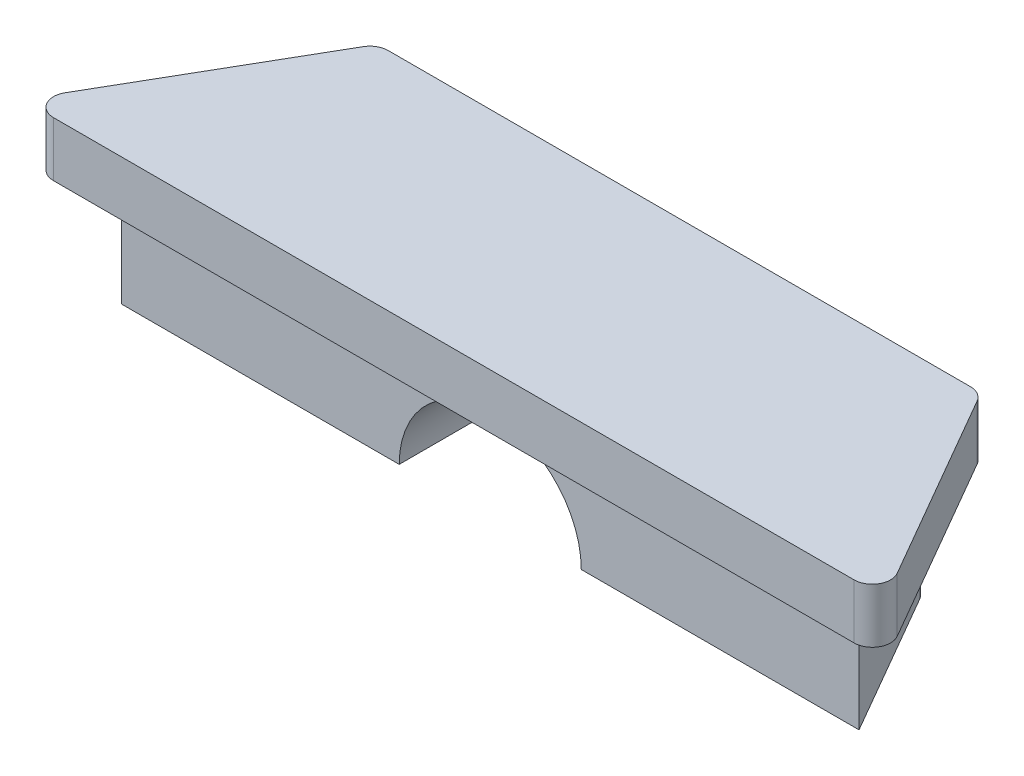
ISO-10303-21;
HEADER;
FILE_DESCRIPTION(('STEP AP214'),'2;1');
FILE_NAME('part.step','',(''),(''),'','','');
FILE_SCHEMA(('AUTOMOTIVE_DESIGN { 1 0 10303 214 1 1 1 1 }'));
ENDSEC;
DATA;
#1=APPLICATION_CONTEXT('core data for automotive mechanical design processes');
#2=APPLICATION_PROTOCOL_DEFINITION('international standard','automotive_design',2000,#1);
#3=PRODUCT_CONTEXT('',#1,'mechanical');
#4=PRODUCT('Part','Part','',(#3));
#5=PRODUCT_RELATED_PRODUCT_CATEGORY('part','',(#4));
#6=PRODUCT_DEFINITION_FORMATION('','',#4);
#7=PRODUCT_DEFINITION_CONTEXT('part definition',#1,'design');
#8=PRODUCT_DEFINITION('design','',#6,#7);
#9=PRODUCT_DEFINITION_SHAPE('','',#8);
#10=(LENGTH_UNIT() NAMED_UNIT(*) SI_UNIT(.MILLI.,.METRE.));
#11=(NAMED_UNIT(*) PLANE_ANGLE_UNIT() SI_UNIT($,.RADIAN.));
#12=(NAMED_UNIT(*) SI_UNIT($,.STERADIAN.) SOLID_ANGLE_UNIT());
#13=UNCERTAINTY_MEASURE_WITH_UNIT(LENGTH_MEASURE(1.E-05),#10,'distance_accuracy_value','');
#14=(GEOMETRIC_REPRESENTATION_CONTEXT(3) GLOBAL_UNCERTAINTY_ASSIGNED_CONTEXT((#13)) GLOBAL_UNIT_ASSIGNED_CONTEXT((#10,
#11,#12)) REPRESENTATION_CONTEXT('',''));
#15=CARTESIAN_POINT('',(0.,0.,0.));
#16=DIRECTION('',(0.,0.,1.));
#17=DIRECTION('',(1.,0.,0.));
#18=AXIS2_PLACEMENT_3D('',#15,#16,#17);
#19=CARTESIAN_POINT('',(-21.0429613812121,0.,-70.8226089891099));
#20=DIRECTION('',(0.,-1.,0.));
#21=DIRECTION('',(0.,0.,-1.));
#22=AXIS2_PLACEMENT_3D('',#19,#20,#21);
#23=PLANE('',#22);
#24=DIRECTION('',(0.,0.,1.));
#25=VECTOR('',#24,1.);
#26=CARTESIAN_POINT('',(-30.8790085716438,0.,-73.4389093969362));
#27=LINE('',#26,#25);
#28=CARTESIAN_POINT('',(-30.8790085716438,0.,-71.8226089891099));
#29=VERTEX_POINT('',#28);
#30=CARTESIAN_POINT('',(-30.8790085716438,0.,-63.4389093969362));
#31=VERTEX_POINT('',#30);
#32=EDGE_CURVE('E11',#29,#31,#27,.T.);
#33=ORIENTED_EDGE('',*,*,#32,.F.);
#34=DIRECTION('',(-1.,0.,0.));
#35=VECTOR('',#34,1.);
#36=CARTESIAN_POINT('',(-21.0429613812121,0.,-71.8226089891099));
#37=LINE('',#36,#35);
#38=CARTESIAN_POINT('',(-21.0429613812121,0.,-71.8226089891099));
#39=VERTEX_POINT('',#38);
#40=EDGE_CURVE('E143',#39,#29,#37,.T.);
#41=ORIENTED_EDGE('',*,*,#40,.F.);
#42=CARTESIAN_POINT('',(-21.0429613812121,0.,-70.8226089891099));
#43=DIRECTION('',(0.,1.,0.));
#44=DIRECTION('',(0.,0.,-1.));
#45=AXIS2_PLACEMENT_3D('',#42,#43,#44);
#46=CIRCLE('',#45,0.999999999999986);
#47=CARTESIAN_POINT('',(-20.1769359774277,0.,-71.3226089891099));
#48=VERTEX_POINT('',#47);
#49=EDGE_CURVE('E138',#48,#39,#46,.T.);
#50=ORIENTED_EDGE('',*,*,#49,.F.);
#51=DIRECTION('',(-0.500000000000046,0.,-0.866025403784412));
#52=VECTOR('',#51,1.);
#53=CARTESIAN_POINT('',(-15.6252798956755,0.,-63.4389093969362));
#54=LINE('',#53,#52);
#55=CARTESIAN_POINT('',(-15.6252798956755,0.,-63.4389093969362));
#56=VERTEX_POINT('',#55);
#57=EDGE_CURVE('E87',#56,#48,#54,.T.);
#58=ORIENTED_EDGE('',*,*,#57,.F.);
#59=DIRECTION('',(1.,0.,0.));
#60=VECTOR('',#59,1.);
#61=CARTESIAN_POINT('',(-15.6252798956755,0.,-63.4389093969362));
#62=LINE('',#61,#60);
#63=EDGE_CURVE('E149',#31,#56,#62,.T.);
#64=ORIENTED_EDGE('',*,*,#63,.F.);
#65=EDGE_LOOP('',(#33,#41,#50,#58,#64));
#66=FACE_BOUND('',#65,.T.);
#67=ADVANCED_FACE('F37',(#66),#23,.T.);
#68=CARTESIAN_POINT('',(-21.0429613812121,6.,-70.8226089891099));
#69=DIRECTION('',(0.,-1.,0.));
#70=DIRECTION('',(0.,0.,-1.));
#71=AXIS2_PLACEMENT_3D('',#68,#69,#70);
#72=CYLINDRICAL_SURFACE('',#71,0.999999999999986);
#73=ORIENTED_EDGE('',*,*,#49,.T.);
#74=DIRECTION('',(0.,-1.,0.));
#75=VECTOR('',#74,1.);
#76=CARTESIAN_POINT('',(-21.0429613812121,6.,-71.8226089891099));
#77=LINE('',#76,#75);
#78=CARTESIAN_POINT('',(-21.0429613812121,6.,-71.8226089891099));
#79=VERTEX_POINT('',#78);
#80=EDGE_CURVE('E158',#79,#39,#77,.T.);
#81=ORIENTED_EDGE('',*,*,#80,.F.);
#82=CARTESIAN_POINT('',(-21.0429613812121,6.,-70.8226089891099));
#83=DIRECTION('',(0.,1.,0.));
#84=DIRECTION('',(0.,0.,-1.));
#85=AXIS2_PLACEMENT_3D('',#82,#83,#84);
#86=CIRCLE('',#85,0.999999999999986);
#87=CARTESIAN_POINT('',(-20.1769359774277,6.,-71.3226089891099));
#88=VERTEX_POINT('',#87);
#89=EDGE_CURVE('E130',#88,#79,#86,.T.);
#90=ORIENTED_EDGE('',*,*,#89,.F.);
#91=DIRECTION('',(0.,-1.,0.));
#92=VECTOR('',#91,1.);
#93=CARTESIAN_POINT('',(-20.1769359774277,6.,-71.3226089891099));
#94=LINE('',#93,#92);
#95=EDGE_CURVE('E137',#88,#48,#94,.T.);
#96=ORIENTED_EDGE('',*,*,#95,.T.);
#97=EDGE_LOOP('',(#73,#81,#90,#96));
#98=FACE_BOUND('',#97,.T.);
#99=ADVANCED_FACE('F39',(#98),#72,.T.);
#100=CARTESIAN_POINT('',(-21.0429613812121,6.,-71.8226089891099));
#101=DIRECTION('',(0.,0.,1.));
#102=DIRECTION('',(1.,0.,0.));
#103=AXIS2_PLACEMENT_3D('',#100,#101,#102);
#104=PLANE('',#103);
#105=ORIENTED_EDGE('',*,*,#40,.T.);
#106=CARTESIAN_POINT('',(-35.8790085716438,0.,-71.8226089891099));
#107=DIRECTION('',(0.,0.,1.));
#108=DIRECTION('',(1.,0.,0.));
#109=AXIS2_PLACEMENT_3D('',#106,#107,#108);
#110=CIRCLE('',#109,5.);
#111=CARTESIAN_POINT('',(-40.8790085716438,0.,-71.8226089891099));
#112=VERTEX_POINT('',#111);
#113=EDGE_CURVE('E164',#29,#112,#110,.T.);
#114=ORIENTED_EDGE('',*,*,#113,.T.);
#115=CARTESIAN_POINT('',(-50.7150557620761,0.,-71.8226089891099));
#116=VERTEX_POINT('',#115);
#117=EDGE_CURVE('E141',#112,#116,#37,.T.);
#118=ORIENTED_EDGE('',*,*,#117,.T.);
#119=DIRECTION('',(0.,-1.,0.));
#120=VECTOR('',#119,1.);
#121=CARTESIAN_POINT('',(-50.7150557620761,6.,-71.8226089891099));
#122=LINE('',#121,#120);
#123=CARTESIAN_POINT('',(-50.7150557620761,6.,-71.8226089891099));
#124=VERTEX_POINT('',#123);
#125=EDGE_CURVE('E115',#124,#116,#122,.T.);
#126=ORIENTED_EDGE('',*,*,#125,.F.);
#127=DIRECTION('',(-1.,0.,0.));
#128=VECTOR('',#127,1.);
#129=CARTESIAN_POINT('',(-21.0429613812121,6.,-71.8226089891099));
#130=LINE('',#129,#128);
#131=EDGE_CURVE('E96',#79,#124,#130,.T.);
#132=ORIENTED_EDGE('',*,*,#131,.F.);
#133=ORIENTED_EDGE('',*,*,#80,.T.);
#134=EDGE_LOOP('',(#105,#114,#118,#126,#132,#133));
#135=FACE_BOUND('',#134,.T.);
#136=ADVANCED_FACE('F171',(#135),#104,.F.);
#137=CARTESIAN_POINT('',(-50.7150557620761,6.,-70.8226089891098));
#138=DIRECTION('',(0.,-1.,0.));
#139=DIRECTION('',(0.,0.,-1.));
#140=AXIS2_PLACEMENT_3D('',#137,#138,#139);
#141=CYLINDRICAL_SURFACE('',#140,1.);
#142=CARTESIAN_POINT('',(-50.7150557620761,0.,-70.8226089891098));
#143=DIRECTION('',(0.,1.,0.));
#144=DIRECTION('',(0.,0.,1.));
#145=AXIS2_PLACEMENT_3D('',#142,#143,#144);
#146=CIRCLE('',#145,1.);
#147=CARTESIAN_POINT('',(-51.5810811658605,0.,-71.3226089891098));
#148=VERTEX_POINT('',#147);
#149=EDGE_CURVE('E112',#116,#148,#146,.T.);
#150=ORIENTED_EDGE('',*,*,#149,.T.);
#151=DIRECTION('',(0.,-1.,0.));
#152=VECTOR('',#151,1.);
#153=CARTESIAN_POINT('',(-51.5810811658605,6.,-71.3226089891098));
#154=LINE('',#153,#152);
#155=CARTESIAN_POINT('',(-51.5810811658605,6.,-71.3226089891098));
#156=VERTEX_POINT('',#155);
#157=EDGE_CURVE('E105',#156,#148,#154,.T.);
#158=ORIENTED_EDGE('',*,*,#157,.F.);
#159=CARTESIAN_POINT('',(-50.7150557620761,6.,-70.8226089891098));
#160=DIRECTION('',(0.,1.,0.));
#161=DIRECTION('',(0.,0.,1.));
#162=AXIS2_PLACEMENT_3D('',#159,#160,#161);
#163=CIRCLE('',#162,1.);
#164=EDGE_CURVE('E110',#124,#156,#163,.T.);
#165=ORIENTED_EDGE('',*,*,#164,.F.);
#166=ORIENTED_EDGE('',*,*,#125,.T.);
#167=EDGE_LOOP('',(#150,#158,#165,#166));
#168=FACE_BOUND('',#167,.T.);
#169=ADVANCED_FACE('F107',(#168),#141,.T.);
#170=CARTESIAN_POINT('',(-56.1327372476121,6.,-63.4389093969362));
#171=DIRECTION('',(0.866025403784439,0.,0.499999999999999));
#172=DIRECTION('',(0.499999999999999,0.,-0.866025403784439));
#173=AXIS2_PLACEMENT_3D('',#170,#171,#172);
#174=PLANE('',#173);
#175=DIRECTION('',(-0.499999999999999,0.,0.866025403784439));
#176=VECTOR('',#175,1.);
#177=CARTESIAN_POINT('',(-56.1327372476121,0.,-63.4389093969362));
#178=LINE('',#177,#176);
#179=CARTESIAN_POINT('',(-56.1327372476121,0.,-63.4389093969362));
#180=VERTEX_POINT('',#179);
#181=EDGE_CURVE('E147',#148,#180,#178,.T.);
#182=ORIENTED_EDGE('',*,*,#181,.T.);
#183=DIRECTION('',(0.,-1.,0.));
#184=VECTOR('',#183,1.);
#185=CARTESIAN_POINT('',(-56.1327372476121,6.,-63.4389093969362));
#186=LINE('',#185,#184);
#187=CARTESIAN_POINT('',(-56.1327372476121,6.,-63.4389093969362));
#188=VERTEX_POINT('',#187);
#189=EDGE_CURVE('E116',#188,#180,#186,.T.);
#190=ORIENTED_EDGE('',*,*,#189,.F.);
#191=DIRECTION('',(-0.499999999999999,0.,0.866025403784439));
#192=VECTOR('',#191,1.);
#193=CARTESIAN_POINT('',(-56.1327372476121,6.,-63.4389093969362));
#194=LINE('',#193,#192);
#195=EDGE_CURVE('E119',#156,#188,#194,.T.);
#196=ORIENTED_EDGE('',*,*,#195,.F.);
#197=ORIENTED_EDGE('',*,*,#157,.T.);
#198=EDGE_LOOP('',(#182,#190,#196,#197));
#199=FACE_BOUND('',#198,.T.);
#200=ADVANCED_FACE('F120',(#199),#174,.F.);
#201=CARTESIAN_POINT('',(-15.6252798956755,6.,-63.4389093969362));
#202=DIRECTION('',(0.,0.,-1.));
#203=DIRECTION('',(-1.,0.,0.));
#204=AXIS2_PLACEMENT_3D('',#201,#202,#203);
#205=PLANE('',#204);
#206=CARTESIAN_POINT('',(-40.8790085716438,0.,-63.4389093969362));
#207=VERTEX_POINT('',#206);
#208=EDGE_CURVE('E150',#180,#207,#62,.T.);
#209=ORIENTED_EDGE('',*,*,#208,.T.);
#210=CARTESIAN_POINT('',(-35.8790085716438,0.,-63.4389093969362));
#211=DIRECTION('',(0.,0.,1.));
#212=DIRECTION('',(1.,0.,0.));
#213=AXIS2_PLACEMENT_3D('',#210,#211,#212);
#214=CIRCLE('',#213,5.);
#215=EDGE_CURVE('E51',#31,#207,#214,.T.);
#216=ORIENTED_EDGE('',*,*,#215,.F.);
#217=ORIENTED_EDGE('',*,*,#63,.T.);
#218=DIRECTION('',(0.,-1.,0.));
#219=VECTOR('',#218,1.);
#220=CARTESIAN_POINT('',(-15.6252798956755,6.,-63.4389093969362));
#221=LINE('',#220,#219);
#222=CARTESIAN_POINT('',(-15.6252798956755,6.,-63.4389093969362));
#223=VERTEX_POINT('',#222);
#224=EDGE_CURVE('E60',#223,#56,#221,.T.);
#225=ORIENTED_EDGE('',*,*,#224,.F.);
#226=DIRECTION('',(1.,0.,0.));
#227=VECTOR('',#226,1.);
#228=CARTESIAN_POINT('',(-15.6252798956755,6.,-63.4389093969362));
#229=LINE('',#228,#227);
#230=EDGE_CURVE('E124',#188,#223,#229,.T.);
#231=ORIENTED_EDGE('',*,*,#230,.F.);
#232=ORIENTED_EDGE('',*,*,#189,.T.);
#233=EDGE_LOOP('',(#209,#216,#217,#225,#231,#232));
#234=FACE_BOUND('',#233,.T.);
#235=ADVANCED_FACE('F175',(#234),#205,.F.);
#236=CARTESIAN_POINT('',(-15.6252798956755,6.,-63.4389093969362));
#237=DIRECTION('',(-0.866025403784412,0.,0.500000000000046));
#238=DIRECTION('',(0.500000000000046,0.,0.866025403784412));
#239=AXIS2_PLACEMENT_3D('',#236,#237,#238);
#240=PLANE('',#239);
#241=ORIENTED_EDGE('',*,*,#57,.T.);
#242=ORIENTED_EDGE('',*,*,#95,.F.);
#243=DIRECTION('',(-0.500000000000046,0.,-0.866025403784412));
#244=VECTOR('',#243,1.);
#245=CARTESIAN_POINT('',(-15.6252798956755,6.,-63.4389093969362));
#246=LINE('',#245,#244);
#247=EDGE_CURVE('E135',#223,#88,#246,.T.);
#248=ORIENTED_EDGE('',*,*,#247,.F.);
#249=ORIENTED_EDGE('',*,*,#224,.T.);
#250=EDGE_LOOP('',(#241,#242,#248,#249));
#251=FACE_BOUND('',#250,.T.);
#252=ADVANCED_FACE('F178',(#251),#240,.F.);
#253=DIRECTION('',(0.,0.,1.));
#254=VECTOR('',#253,1.);
#255=CARTESIAN_POINT('',(-40.8790085716438,0.,-73.4389093969362));
#256=LINE('',#255,#254);
#257=EDGE_CURVE('E45',#207,#112,#256,.F.);
#258=ORIENTED_EDGE('',*,*,#257,.F.);
#259=ORIENTED_EDGE('',*,*,#208,.F.);
#260=ORIENTED_EDGE('',*,*,#181,.F.);
#261=ORIENTED_EDGE('',*,*,#149,.F.);
#262=ORIENTED_EDGE('',*,*,#117,.F.);
#263=EDGE_LOOP('',(#258,#259,#260,#261,#262));
#264=FACE_BOUND('',#263,.T.);
#265=ADVANCED_FACE('F174',(#264),#23,.T.);
#266=CARTESIAN_POINT('',(-57.864788055181,6.,-62.4389093969362));
#267=DIRECTION('',(0.,1.,0.));
#268=DIRECTION('',(0.,0.,1.));
#269=AXIS2_PLACEMENT_3D('',#266,#267,#268);
#270=PLANE('',#269);
#271=CARTESIAN_POINT('',(-57.864788055181,6.,-62.4389093969362));
#272=DIRECTION('',(0.,1.,0.));
#273=DIRECTION('',(0.,0.,1.));
#274=AXIS2_PLACEMENT_3D('',#271,#272,#273);
#275=CIRCLE('',#274,1.);
#276=CARTESIAN_POINT('',(-58.7308134589655,6.,-62.9389093969362));
#277=VERTEX_POINT('',#276);
#278=CARTESIAN_POINT('',(-57.864788055181,6.,-61.4389093969362));
#279=VERTEX_POINT('',#278);
#280=EDGE_CURVE('E172',#277,#279,#275,.T.);
#281=ORIENTED_EDGE('',*,*,#280,.F.);
#282=DIRECTION('',(-0.5,0.,0.866025403784438));
#283=VECTOR('',#282,1.);
#284=CARTESIAN_POINT('',(-52.7357817042398,6.,-73.3226089891099));
#285=LINE('',#284,#283);
#286=CARTESIAN_POINT('',(-52.7357817042398,6.,-73.3226089891099));
#287=VERTEX_POINT('',#286);
#288=EDGE_CURVE('E192',#287,#277,#285,.T.);
#289=ORIENTED_EDGE('',*,*,#288,.F.);
#290=CARTESIAN_POINT('',(-51.8697563004554,6.,-72.8226089891099));
#291=DIRECTION('',(0.,1.,0.));
#292=DIRECTION('',(0.,0.,1.));
#293=AXIS2_PLACEMENT_3D('',#290,#291,#292);
#294=CIRCLE('',#293,1.);
#295=CARTESIAN_POINT('',(-51.8697563004554,6.,-73.8226089891099));
#296=VERTEX_POINT('',#295);
#297=EDGE_CURVE('E231',#296,#287,#294,.T.);
#298=ORIENTED_EDGE('',*,*,#297,.F.);
#299=DIRECTION('',(-1.,0.,0.));
#300=VECTOR('',#299,1.);
#301=CARTESIAN_POINT('',(-51.8697563004554,6.,-73.8226089891099));
#302=LINE('',#301,#300);
#303=CARTESIAN_POINT('',(-19.8882608428319,6.,-73.8226089891099));
#304=VERTEX_POINT('',#303);
#305=EDGE_CURVE('E228',#304,#296,#302,.T.);
#306=ORIENTED_EDGE('',*,*,#305,.F.);
#307=CARTESIAN_POINT('',(-19.8882608428319,6.,-72.8226089891099));
#308=DIRECTION('',(0.,1.,0.));
#309=DIRECTION('',(0.,0.,1.));
#310=AXIS2_PLACEMENT_3D('',#307,#308,#309);
#311=CIRCLE('',#310,1.);
#312=CARTESIAN_POINT('',(-19.0222354390474,6.,-73.3226089891099));
#313=VERTEX_POINT('',#312);
#314=EDGE_CURVE('E225',#313,#304,#311,.T.);
#315=ORIENTED_EDGE('',*,*,#314,.F.);
#316=DIRECTION('',(-0.5,0.,-0.866025403784439));
#317=VECTOR('',#316,1.);
#318=CARTESIAN_POINT('',(-13.0272036843218,6.,-62.9389093969362));
#319=LINE('',#318,#317);
#320=CARTESIAN_POINT('',(-13.0272036843218,6.,-62.9389093969362));
#321=VERTEX_POINT('',#320);
#322=EDGE_CURVE('E222',#321,#313,#319,.T.);
#323=ORIENTED_EDGE('',*,*,#322,.F.);
#324=CARTESIAN_POINT('',(-13.8932290881062,6.,-62.4389093969362));
#325=DIRECTION('',(0.,1.,0.));
#326=DIRECTION('',(0.,0.,-1.));
#327=AXIS2_PLACEMENT_3D('',#324,#325,#326);
#328=CIRCLE('',#327,1.);
#329=CARTESIAN_POINT('',(-13.8932290881062,6.,-61.4389093969362));
#330=VERTEX_POINT('',#329);
#331=EDGE_CURVE('E219',#330,#321,#328,.T.);
#332=ORIENTED_EDGE('',*,*,#331,.F.);
#333=DIRECTION('',(1.,0.,0.));
#334=VECTOR('',#333,1.);
#335=CARTESIAN_POINT('',(-13.8932290881062,6.,-61.4389093969362));
#336=LINE('',#335,#334);
#337=EDGE_CURVE('E216',#279,#330,#336,.T.);
#338=ORIENTED_EDGE('',*,*,#337,.F.);
#339=EDGE_LOOP('',(#281,#289,#298,#306,#315,#323,#332,#338));
#340=FACE_BOUND('',#339,.T.);
#341=ORIENTED_EDGE('',*,*,#247,.T.);
#342=ORIENTED_EDGE('',*,*,#89,.T.);
#343=ORIENTED_EDGE('',*,*,#131,.T.);
#344=ORIENTED_EDGE('',*,*,#164,.T.);
#345=ORIENTED_EDGE('',*,*,#195,.T.);
#346=ORIENTED_EDGE('',*,*,#230,.T.);
#347=EDGE_LOOP('',(#341,#342,#343,#344,#345,#346));
#348=FACE_BOUND('',#347,.T.);
#349=ADVANCED_FACE('F127',(#340,#348),#270,.F.);
#350=CARTESIAN_POINT('',(-57.864788055181,9.,-62.4389093969362));
#351=DIRECTION('',(0.,-1.,0.));
#352=DIRECTION('',(0.,0.,-1.));
#353=AXIS2_PLACEMENT_3D('',#350,#351,#352);
#354=CYLINDRICAL_SURFACE('',#353,1.);
#355=ORIENTED_EDGE('',*,*,#280,.T.);
#356=DIRECTION('',(0.,-1.,0.));
#357=VECTOR('',#356,1.);
#358=CARTESIAN_POINT('',(-57.864788055181,9.,-61.4389093969362));
#359=LINE('',#358,#357);
#360=CARTESIAN_POINT('',(-57.864788055181,9.,-61.4389093969362));
#361=VERTEX_POINT('',#360);
#362=EDGE_CURVE('E142',#361,#279,#359,.T.);
#363=ORIENTED_EDGE('',*,*,#362,.F.);
#364=CARTESIAN_POINT('',(-57.864788055181,9.,-62.4389093969362));
#365=DIRECTION('',(0.,1.,0.));
#366=DIRECTION('',(0.,0.,1.));
#367=AXIS2_PLACEMENT_3D('',#364,#365,#366);
#368=CIRCLE('',#367,1.);
#369=CARTESIAN_POINT('',(-58.7308134589655,9.,-62.9389093969362));
#370=VERTEX_POINT('',#369);
#371=EDGE_CURVE('E188',#370,#361,#368,.T.);
#372=ORIENTED_EDGE('',*,*,#371,.F.);
#373=DIRECTION('',(0.,-1.,0.));
#374=VECTOR('',#373,1.);
#375=CARTESIAN_POINT('',(-58.7308134589655,9.,-62.9389093969362));
#376=LINE('',#375,#374);
#377=EDGE_CURVE('E213',#370,#277,#376,.T.);
#378=ORIENTED_EDGE('',*,*,#377,.T.);
#379=EDGE_LOOP('',(#355,#363,#372,#378));
#380=FACE_BOUND('',#379,.T.);
#381=ADVANCED_FACE('F269',(#380),#354,.T.);
#382=CARTESIAN_POINT('',(-13.8932290881062,9.,-61.4389093969362));
#383=DIRECTION('',(0.,0.,-1.));
#384=DIRECTION('',(-1.,0.,0.));
#385=AXIS2_PLACEMENT_3D('',#382,#383,#384);
#386=PLANE('',#385);
#387=ORIENTED_EDGE('',*,*,#337,.T.);
#388=DIRECTION('',(0.,-1.,0.));
#389=VECTOR('',#388,1.);
#390=CARTESIAN_POINT('',(-13.8932290881062,9.,-61.4389093969362));
#391=LINE('',#390,#389);
#392=CARTESIAN_POINT('',(-13.8932290881062,9.,-61.4389093969362));
#393=VERTEX_POINT('',#392);
#394=EDGE_CURVE('E253',#393,#330,#391,.T.);
#395=ORIENTED_EDGE('',*,*,#394,.F.);
#396=DIRECTION('',(1.,0.,0.));
#397=VECTOR('',#396,1.);
#398=CARTESIAN_POINT('',(-13.8932290881062,9.,-61.4389093969362));
#399=LINE('',#398,#397);
#400=EDGE_CURVE('E191',#361,#393,#399,.T.);
#401=ORIENTED_EDGE('',*,*,#400,.F.);
#402=ORIENTED_EDGE('',*,*,#362,.T.);
#403=EDGE_LOOP('',(#387,#395,#401,#402));
#404=FACE_BOUND('',#403,.T.);
#405=ADVANCED_FACE('F260',(#404),#386,.F.);
#406=CARTESIAN_POINT('',(-13.8932290881062,9.,-62.4389093969362));
#407=DIRECTION('',(0.,-1.,0.));
#408=DIRECTION('',(0.,0.,-1.));
#409=AXIS2_PLACEMENT_3D('',#406,#407,#408);
#410=CYLINDRICAL_SURFACE('',#409,1.);
#411=ORIENTED_EDGE('',*,*,#331,.T.);
#412=DIRECTION('',(0.,-1.,0.));
#413=VECTOR('',#412,1.);
#414=CARTESIAN_POINT('',(-13.0272036843218,9.,-62.9389093969362));
#415=LINE('',#414,#413);
#416=CARTESIAN_POINT('',(-13.0272036843218,9.,-62.9389093969362));
#417=VERTEX_POINT('',#416);
#418=EDGE_CURVE('E250',#417,#321,#415,.T.);
#419=ORIENTED_EDGE('',*,*,#418,.F.);
#420=CARTESIAN_POINT('',(-13.8932290881062,9.,-62.4389093969362));
#421=DIRECTION('',(0.,1.,0.));
#422=DIRECTION('',(0.,0.,-1.));
#423=AXIS2_PLACEMENT_3D('',#420,#421,#422);
#424=CIRCLE('',#423,1.);
#425=EDGE_CURVE('E195',#393,#417,#424,.T.);
#426=ORIENTED_EDGE('',*,*,#425,.F.);
#427=ORIENTED_EDGE('',*,*,#394,.T.);
#428=EDGE_LOOP('',(#411,#419,#426,#427));
#429=FACE_BOUND('',#428,.T.);
#430=ADVANCED_FACE('F307',(#429),#410,.T.);
#431=CARTESIAN_POINT('',(-13.0272036843218,9.,-62.9389093969362));
#432=DIRECTION('',(-0.866025403784439,0.,0.5));
#433=DIRECTION('',(0.5,0.,0.866025403784439));
#434=AXIS2_PLACEMENT_3D('',#431,#432,#433);
#435=PLANE('',#434);
#436=ORIENTED_EDGE('',*,*,#322,.T.);
#437=DIRECTION('',(0.,-1.,0.));
#438=VECTOR('',#437,1.);
#439=CARTESIAN_POINT('',(-19.0222354390474,9.,-73.3226089891099));
#440=LINE('',#439,#438);
#441=CARTESIAN_POINT('',(-19.0222354390474,9.,-73.3226089891099));
#442=VERTEX_POINT('',#441);
#443=EDGE_CURVE('E247',#442,#313,#440,.T.);
#444=ORIENTED_EDGE('',*,*,#443,.F.);
#445=DIRECTION('',(-0.5,0.,-0.866025403784439));
#446=VECTOR('',#445,1.);
#447=CARTESIAN_POINT('',(-13.0272036843218,9.,-62.9389093969362));
#448=LINE('',#447,#446);
#449=EDGE_CURVE('E198',#417,#442,#448,.T.);
#450=ORIENTED_EDGE('',*,*,#449,.F.);
#451=ORIENTED_EDGE('',*,*,#418,.T.);
#452=EDGE_LOOP('',(#436,#444,#450,#451));
#453=FACE_BOUND('',#452,.T.);
#454=ADVANCED_FACE('F312',(#453),#435,.F.);
#455=CARTESIAN_POINT('',(-19.8882608428319,9.,-72.8226089891099));
#456=DIRECTION('',(0.,-1.,0.));
#457=DIRECTION('',(0.,0.,-1.));
#458=AXIS2_PLACEMENT_3D('',#455,#456,#457);
#459=CYLINDRICAL_SURFACE('',#458,1.);
#460=ORIENTED_EDGE('',*,*,#314,.T.);
#461=DIRECTION('',(0.,-1.,0.));
#462=VECTOR('',#461,1.);
#463=CARTESIAN_POINT('',(-19.8882608428319,9.,-73.8226089891099));
#464=LINE('',#463,#462);
#465=CARTESIAN_POINT('',(-19.8882608428319,9.,-73.8226089891099));
#466=VERTEX_POINT('',#465);
#467=EDGE_CURVE('E244',#466,#304,#464,.T.);
#468=ORIENTED_EDGE('',*,*,#467,.F.);
#469=CARTESIAN_POINT('',(-19.8882608428319,9.,-72.8226089891099));
#470=DIRECTION('',(0.,1.,0.));
#471=DIRECTION('',(0.,0.,1.));
#472=AXIS2_PLACEMENT_3D('',#469,#470,#471);
#473=CIRCLE('',#472,1.);
#474=EDGE_CURVE('E201',#442,#466,#473,.T.);
#475=ORIENTED_EDGE('',*,*,#474,.F.);
#476=ORIENTED_EDGE('',*,*,#443,.T.);
#477=EDGE_LOOP('',(#460,#468,#475,#476));
#478=FACE_BOUND('',#477,.T.);
#479=ADVANCED_FACE('F318',(#478),#459,.T.);
#480=CARTESIAN_POINT('',(-51.8697563004554,9.,-73.8226089891099));
#481=DIRECTION('',(0.,0.,1.));
#482=DIRECTION('',(1.,0.,0.));
#483=AXIS2_PLACEMENT_3D('',#480,#481,#482);
#484=PLANE('',#483);
#485=ORIENTED_EDGE('',*,*,#305,.T.);
#486=DIRECTION('',(0.,-1.,0.));
#487=VECTOR('',#486,1.);
#488=CARTESIAN_POINT('',(-51.8697563004554,9.,-73.8226089891099));
#489=LINE('',#488,#487);
#490=CARTESIAN_POINT('',(-51.8697563004554,9.,-73.8226089891099));
#491=VERTEX_POINT('',#490);
#492=EDGE_CURVE('E241',#491,#296,#489,.T.);
#493=ORIENTED_EDGE('',*,*,#492,.F.);
#494=DIRECTION('',(-1.,0.,0.));
#495=VECTOR('',#494,1.);
#496=CARTESIAN_POINT('',(-51.8697563004554,9.,-73.8226089891099));
#497=LINE('',#496,#495);
#498=EDGE_CURVE('E204',#466,#491,#497,.T.);
#499=ORIENTED_EDGE('',*,*,#498,.F.);
#500=ORIENTED_EDGE('',*,*,#467,.T.);
#501=EDGE_LOOP('',(#485,#493,#499,#500));
#502=FACE_BOUND('',#501,.T.);
#503=ADVANCED_FACE('F322',(#502),#484,.F.);
#504=CARTESIAN_POINT('',(-51.8697563004554,9.,-72.8226089891099));
#505=DIRECTION('',(0.,-1.,0.));
#506=DIRECTION('',(0.,0.,-1.));
#507=AXIS2_PLACEMENT_3D('',#504,#505,#506);
#508=CYLINDRICAL_SURFACE('',#507,1.);
#509=ORIENTED_EDGE('',*,*,#297,.T.);
#510=DIRECTION('',(0.,-1.,0.));
#511=VECTOR('',#510,1.);
#512=CARTESIAN_POINT('',(-52.7357817042398,9.,-73.3226089891099));
#513=LINE('',#512,#511);
#514=CARTESIAN_POINT('',(-52.7357817042398,9.,-73.3226089891099));
#515=VERTEX_POINT('',#514);
#516=EDGE_CURVE('E238',#515,#287,#513,.T.);
#517=ORIENTED_EDGE('',*,*,#516,.F.);
#518=CARTESIAN_POINT('',(-51.8697563004554,9.,-72.8226089891099));
#519=DIRECTION('',(0.,1.,0.));
#520=DIRECTION('',(0.,0.,1.));
#521=AXIS2_PLACEMENT_3D('',#518,#519,#520);
#522=CIRCLE('',#521,1.);
#523=EDGE_CURVE('E207',#491,#515,#522,.T.);
#524=ORIENTED_EDGE('',*,*,#523,.F.);
#525=ORIENTED_EDGE('',*,*,#492,.T.);
#526=EDGE_LOOP('',(#509,#517,#524,#525));
#527=FACE_BOUND('',#526,.T.);
#528=ADVANCED_FACE('F326',(#527),#508,.T.);
#529=CARTESIAN_POINT('',(-52.7357817042398,9.,-73.3226089891099));
#530=DIRECTION('',(0.866025403784439,0.,0.5));
#531=DIRECTION('',(0.5,0.,-0.866025403784439));
#532=AXIS2_PLACEMENT_3D('',#529,#530,#531);
#533=PLANE('',#532);
#534=ORIENTED_EDGE('',*,*,#288,.T.);
#535=ORIENTED_EDGE('',*,*,#377,.F.);
#536=DIRECTION('',(-0.5,0.,0.866025403784438));
#537=VECTOR('',#536,1.);
#538=CARTESIAN_POINT('',(-52.7357817042398,9.,-73.3226089891099));
#539=LINE('',#538,#537);
#540=EDGE_CURVE('E210',#515,#370,#539,.T.);
#541=ORIENTED_EDGE('',*,*,#540,.F.);
#542=ORIENTED_EDGE('',*,*,#516,.T.);
#543=EDGE_LOOP('',(#534,#535,#541,#542));
#544=FACE_BOUND('',#543,.T.);
#545=ADVANCED_FACE('F328',(#544),#533,.F.);
#546=CARTESIAN_POINT('',(-57.864788055181,9.,-62.4389093969362));
#547=DIRECTION('',(0.,1.,0.));
#548=DIRECTION('',(0.,0.,1.));
#549=AXIS2_PLACEMENT_3D('',#546,#547,#548);
#550=PLANE('',#549);
#551=ORIENTED_EDGE('',*,*,#371,.T.);
#552=ORIENTED_EDGE('',*,*,#400,.T.);
#553=ORIENTED_EDGE('',*,*,#425,.T.);
#554=ORIENTED_EDGE('',*,*,#449,.T.);
#555=ORIENTED_EDGE('',*,*,#474,.T.);
#556=ORIENTED_EDGE('',*,*,#498,.T.);
#557=ORIENTED_EDGE('',*,*,#523,.T.);
#558=ORIENTED_EDGE('',*,*,#540,.T.);
#559=EDGE_LOOP('',(#551,#552,#553,#554,#555,#556,#557,#558));
#560=FACE_BOUND('',#559,.T.);
#561=ADVANCED_FACE('F303',(#560),#550,.T.);
#562=CARTESIAN_POINT('',(-35.8790085716438,0.,-73.4389093969362));
#563=DIRECTION('',(0.,0.,1.));
#564=DIRECTION('',(1.,0.,0.));
#565=AXIS2_PLACEMENT_3D('',#562,#563,#564);
#566=CYLINDRICAL_SURFACE('',#565,5.);
#567=ORIENTED_EDGE('',*,*,#32,.T.);
#568=ORIENTED_EDGE('',*,*,#215,.T.);
#569=ORIENTED_EDGE('',*,*,#257,.T.);
#570=ORIENTED_EDGE('',*,*,#113,.F.);
#571=EDGE_LOOP('',(#567,#568,#569,#570));
#572=FACE_BOUND('',#571,.T.);
#573=ADVANCED_FACE('F162',(#572),#566,.F.);
#574=CLOSED_SHELL('',(#67,#99,#136,#169,#200,#235,#252,#265,#349,#381,#405,#430,#454,#479,#503,
#528,#545,#561,#573));
#575=MANIFOLD_SOLID_BREP('B2',#574);
#576=ADVANCED_BREP_SHAPE_REPRESENTATION('',(#18,#575),#14);
#577=SHAPE_DEFINITION_REPRESENTATION(#9,#576);
ENDSEC;
END-ISO-10303-21;
